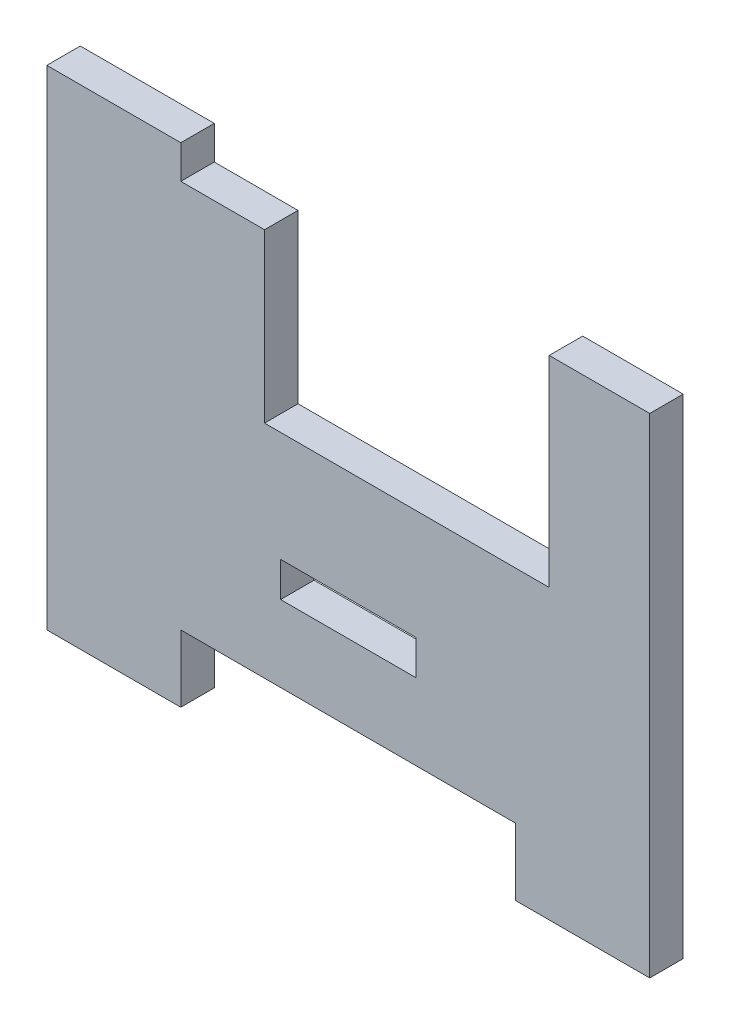
ISO-10303-21;
HEADER;
FILE_DESCRIPTION(('STEP AP214'),'2;1');
FILE_NAME('part.step','',(''),(''),'','','');
FILE_SCHEMA(('AUTOMOTIVE_DESIGN { 1 0 10303 214 1 1 1 1 }'));
ENDSEC;
DATA;
#1=APPLICATION_CONTEXT('core data for automotive mechanical design processes');
#2=APPLICATION_PROTOCOL_DEFINITION('international standard','automotive_design',2000,#1);
#3=PRODUCT_CONTEXT('',#1,'mechanical');
#4=PRODUCT('Part','Part','',(#3));
#5=PRODUCT_RELATED_PRODUCT_CATEGORY('part','',(#4));
#6=PRODUCT_DEFINITION_FORMATION('','',#4);
#7=PRODUCT_DEFINITION_CONTEXT('part definition',#1,'design');
#8=PRODUCT_DEFINITION('design','',#6,#7);
#9=PRODUCT_DEFINITION_SHAPE('','',#8);
#10=(LENGTH_UNIT() NAMED_UNIT(*) SI_UNIT(.MILLI.,.METRE.));
#11=(NAMED_UNIT(*) PLANE_ANGLE_UNIT() SI_UNIT($,.RADIAN.));
#12=(NAMED_UNIT(*) SI_UNIT($,.STERADIAN.) SOLID_ANGLE_UNIT());
#13=UNCERTAINTY_MEASURE_WITH_UNIT(LENGTH_MEASURE(1.E-05),#10,'distance_accuracy_value','');
#14=(GEOMETRIC_REPRESENTATION_CONTEXT(3) GLOBAL_UNCERTAINTY_ASSIGNED_CONTEXT((#13)) GLOBAL_UNIT_ASSIGNED_CONTEXT((#10,
#11,#12)) REPRESENTATION_CONTEXT('',''));
#15=CARTESIAN_POINT('',(0.,0.,0.));
#16=DIRECTION('',(0.,0.,1.));
#17=DIRECTION('',(1.,0.,0.));
#18=AXIS2_PLACEMENT_3D('',#15,#16,#17);
#19=CARTESIAN_POINT('',(0.,-52.5929999999991,-6.35));
#20=DIRECTION('',(0.,-1.,0.));
#21=DIRECTION('',(0.,0.,-1.));
#22=AXIS2_PLACEMENT_3D('',#19,#20,#21);
#23=PLANE('',#22);
#24=DIRECTION('',(1.,0.,0.));
#25=VECTOR('',#24,1.);
#26=CARTESIAN_POINT('',(0.,-52.5929999999991,0.));
#27=LINE('',#26,#25);
#28=CARTESIAN_POINT('',(-152.527000000001,-52.5929999999991,0.));
#29=VERTEX_POINT('',#28);
#30=CARTESIAN_POINT('',(-126.873000000001,-52.5929999999991,0.));
#31=VERTEX_POINT('',#30);
#32=EDGE_CURVE('E238',#29,#31,#27,.T.);
#33=ORIENTED_EDGE('',*,*,#32,.F.);
#34=DIRECTION('',(0.,0.,1.));
#35=VECTOR('',#34,1.);
#36=CARTESIAN_POINT('',(-152.527000000001,-52.5929999999991,-6.35));
#37=LINE('',#36,#35);
#38=CARTESIAN_POINT('',(-152.527000000001,-52.5929999999991,-6.35));
#39=VERTEX_POINT('',#38);
#40=EDGE_CURVE('E11',#39,#29,#37,.T.);
#41=ORIENTED_EDGE('',*,*,#40,.F.);
#42=DIRECTION('',(1.,0.,0.));
#43=VECTOR('',#42,1.);
#44=CARTESIAN_POINT('',(0.,-52.5929999999991,-6.35));
#45=LINE('',#44,#43);
#46=CARTESIAN_POINT('',(-126.873000000001,-52.5929999999991,-6.35));
#47=VERTEX_POINT('',#46);
#48=EDGE_CURVE('E192',#39,#47,#45,.T.);
#49=ORIENTED_EDGE('',*,*,#48,.T.);
#50=DIRECTION('',(0.,0.,1.));
#51=VECTOR('',#50,1.);
#52=CARTESIAN_POINT('',(-126.873000000001,-52.5929999999991,-6.35));
#53=LINE('',#52,#51);
#54=EDGE_CURVE('E183',#47,#31,#53,.T.);
#55=ORIENTED_EDGE('',*,*,#54,.T.);
#56=EDGE_LOOP('',(#33,#41,#49,#55));
#57=FACE_BOUND('',#56,.T.);
#58=ADVANCED_FACE('F43',(#57),#23,.T.);
#59=CARTESIAN_POINT('',(-152.527000000001,0.,-6.35));
#60=DIRECTION('',(1.,0.,0.));
#61=DIRECTION('',(0.,0.,-1.));
#62=AXIS2_PLACEMENT_3D('',#59,#60,#61);
#63=PLANE('',#62);
#64=DIRECTION('',(0.,1.,0.));
#65=VECTOR('',#64,1.);
#66=CARTESIAN_POINT('',(-152.527000000001,0.,0.));
#67=LINE('',#66,#65);
#68=CARTESIAN_POINT('',(-152.527000000001,-59.1969999999991,0.));
#69=VERTEX_POINT('',#68);
#70=EDGE_CURVE('E244',#69,#29,#67,.T.);
#71=ORIENTED_EDGE('',*,*,#70,.F.);
#72=DIRECTION('',(0.,0.,1.));
#73=VECTOR('',#72,1.);
#74=CARTESIAN_POINT('',(-152.527000000001,-59.1969999999991,-6.35));
#75=LINE('',#74,#73);
#76=CARTESIAN_POINT('',(-152.527000000001,-59.1969999999991,-6.35));
#77=VERTEX_POINT('',#76);
#78=EDGE_CURVE('E53',#77,#69,#75,.T.);
#79=ORIENTED_EDGE('',*,*,#78,.F.);
#80=DIRECTION('',(0.,1.,0.));
#81=VECTOR('',#80,1.);
#82=CARTESIAN_POINT('',(-152.527000000001,0.,-6.35));
#83=LINE('',#82,#81);
#84=EDGE_CURVE('E189',#77,#39,#83,.T.);
#85=ORIENTED_EDGE('',*,*,#84,.T.);
#86=ORIENTED_EDGE('',*,*,#40,.T.);
#87=EDGE_LOOP('',(#71,#79,#85,#86));
#88=FACE_BOUND('',#87,.T.);
#89=ADVANCED_FACE('F379',(#88),#63,.T.);
#90=CARTESIAN_POINT('',(0.,-59.1969999999991,-6.35));
#91=DIRECTION('',(0.,1.,0.));
#92=DIRECTION('',(-1.,0.,0.));
#93=AXIS2_PLACEMENT_3D('',#90,#91,#92);
#94=PLANE('',#93);
#95=DIRECTION('',(-1.,0.,0.));
#96=VECTOR('',#95,1.);
#97=CARTESIAN_POINT('',(0.,-59.1969999999991,0.));
#98=LINE('',#97,#96);
#99=CARTESIAN_POINT('',(-126.873000000001,-59.1969999999991,0.));
#100=VERTEX_POINT('',#99);
#101=EDGE_CURVE('E178',#100,#69,#98,.T.);
#102=ORIENTED_EDGE('',*,*,#101,.F.);
#103=DIRECTION('',(0.,0.,1.));
#104=VECTOR('',#103,1.);
#105=CARTESIAN_POINT('',(-126.873000000001,-59.1969999999991,-6.35));
#106=LINE('',#105,#104);
#107=CARTESIAN_POINT('',(-126.873000000001,-59.1969999999991,-6.35));
#108=VERTEX_POINT('',#107);
#109=EDGE_CURVE('E173',#108,#100,#106,.T.);
#110=ORIENTED_EDGE('',*,*,#109,.F.);
#111=DIRECTION('',(-1.,0.,0.));
#112=VECTOR('',#111,1.);
#113=CARTESIAN_POINT('',(0.,-59.1969999999991,-6.35));
#114=LINE('',#113,#112);
#115=EDGE_CURVE('E176',#108,#77,#114,.T.);
#116=ORIENTED_EDGE('',*,*,#115,.T.);
#117=ORIENTED_EDGE('',*,*,#78,.T.);
#118=EDGE_LOOP('',(#102,#110,#116,#117));
#119=FACE_BOUND('',#118,.T.);
#120=ADVANCED_FACE('F175',(#119),#94,.T.);
#121=CARTESIAN_POINT('',(0.,0.,-6.35));
#122=DIRECTION('',(0.,1.,0.));
#123=DIRECTION('',(-1.,0.,0.));
#124=AXIS2_PLACEMENT_3D('',#121,#122,#123);
#125=PLANE('',#124);
#126=DIRECTION('',(-1.,0.,0.));
#127=VECTOR('',#126,1.);
#128=CARTESIAN_POINT('',(0.,0.,0.));
#129=LINE('',#128,#127);
#130=CARTESIAN_POINT('',(-155.575,0.,0.));
#131=VERTEX_POINT('',#130);
#132=CARTESIAN_POINT('',(-171.45,0.,0.));
#133=VERTEX_POINT('',#132);
#134=EDGE_CURVE('E199',#131,#133,#129,.T.);
#135=ORIENTED_EDGE('',*,*,#134,.F.);
#136=DIRECTION('',(0.,0.,1.));
#137=VECTOR('',#136,1.);
#138=CARTESIAN_POINT('',(-155.575,0.,-6.35));
#139=LINE('',#138,#137);
#140=CARTESIAN_POINT('',(-155.575,0.,-6.35));
#141=VERTEX_POINT('',#140);
#142=EDGE_CURVE('E250',#141,#131,#139,.T.);
#143=ORIENTED_EDGE('',*,*,#142,.F.);
#144=DIRECTION('',(-1.,0.,0.));
#145=VECTOR('',#144,1.);
#146=CARTESIAN_POINT('',(0.,0.,-6.35));
#147=LINE('',#146,#145);
#148=CARTESIAN_POINT('',(-171.45,0.,-6.35));
#149=VERTEX_POINT('',#148);
#150=EDGE_CURVE('E246',#141,#149,#147,.T.);
#151=ORIENTED_EDGE('',*,*,#150,.T.);
#152=DIRECTION('',(0.,0.,1.));
#153=VECTOR('',#152,1.);
#154=CARTESIAN_POINT('',(-171.45,0.,-6.35));
#155=LINE('',#154,#153);
#156=EDGE_CURVE('E47',#149,#133,#155,.T.);
#157=ORIENTED_EDGE('',*,*,#156,.T.);
#158=EDGE_LOOP('',(#135,#143,#151,#157));
#159=FACE_BOUND('',#158,.T.);
#160=ADVANCED_FACE('F45',(#159),#125,.T.);
#161=CARTESIAN_POINT('',(-155.575,0.,-6.35));
#162=DIRECTION('',(1.,0.,0.));
#163=DIRECTION('',(0.,0.,-1.));
#164=AXIS2_PLACEMENT_3D('',#161,#162,#163);
#165=PLANE('',#164);
#166=DIRECTION('',(0.,1.,0.));
#167=VECTOR('',#166,1.);
#168=CARTESIAN_POINT('',(-155.575,0.,0.));
#169=LINE('',#168,#167);
#170=CARTESIAN_POINT('',(-155.575,-31.75,0.));
#171=VERTEX_POINT('',#170);
#172=EDGE_CURVE('E235',#171,#131,#169,.T.);
#173=ORIENTED_EDGE('',*,*,#172,.F.);
#174=DIRECTION('',(0.,0.,1.));
#175=VECTOR('',#174,1.);
#176=CARTESIAN_POINT('',(-155.575,-31.75,-6.35));
#177=LINE('',#176,#175);
#178=CARTESIAN_POINT('',(-155.575,-31.75,-6.35));
#179=VERTEX_POINT('',#178);
#180=EDGE_CURVE('E252',#179,#171,#177,.T.);
#181=ORIENTED_EDGE('',*,*,#180,.F.);
#182=DIRECTION('',(0.,1.,0.));
#183=VECTOR('',#182,1.);
#184=CARTESIAN_POINT('',(-155.575,0.,-6.35));
#185=LINE('',#184,#183);
#186=EDGE_CURVE('E194',#179,#141,#185,.T.);
#187=ORIENTED_EDGE('',*,*,#186,.T.);
#188=ORIENTED_EDGE('',*,*,#142,.T.);
#189=EDGE_LOOP('',(#173,#181,#187,#188));
#190=FACE_BOUND('',#189,.T.);
#191=ADVANCED_FACE('F291',(#190),#165,.T.);
#192=CARTESIAN_POINT('',(0.,-31.75,-6.35));
#193=DIRECTION('',(0.,1.,0.));
#194=DIRECTION('',(-1.,0.,0.));
#195=AXIS2_PLACEMENT_3D('',#192,#193,#194);
#196=PLANE('',#195);
#197=DIRECTION('',(-1.,0.,0.));
#198=VECTOR('',#197,1.);
#199=CARTESIAN_POINT('',(0.,-31.75,0.));
#200=LINE('',#199,#198);
#201=CARTESIAN_POINT('',(-101.6,-31.75,0.));
#202=VERTEX_POINT('',#201);
#203=EDGE_CURVE('E232',#202,#171,#200,.T.);
#204=ORIENTED_EDGE('',*,*,#203,.F.);
#205=DIRECTION('',(0.,0.,1.));
#206=VECTOR('',#205,1.);
#207=CARTESIAN_POINT('',(-101.6,-31.75,-6.35));
#208=LINE('',#207,#206);
#209=CARTESIAN_POINT('',(-101.6,-31.75,-6.35));
#210=VERTEX_POINT('',#209);
#211=EDGE_CURVE('E254',#210,#202,#208,.T.);
#212=ORIENTED_EDGE('',*,*,#211,.F.);
#213=DIRECTION('',(-1.,0.,0.));
#214=VECTOR('',#213,1.);
#215=CARTESIAN_POINT('',(0.,-31.75,-6.35));
#216=LINE('',#215,#214);
#217=EDGE_CURVE('E324',#210,#179,#216,.T.);
#218=ORIENTED_EDGE('',*,*,#217,.T.);
#219=ORIENTED_EDGE('',*,*,#180,.T.);
#220=EDGE_LOOP('',(#204,#212,#218,#219));
#221=FACE_BOUND('',#220,.T.);
#222=ADVANCED_FACE('F326',(#221),#196,.T.);
#223=CARTESIAN_POINT('',(-101.6,0.,-6.35));
#224=DIRECTION('',(1.,0.,0.));
#225=DIRECTION('',(0.,0.,-1.));
#226=AXIS2_PLACEMENT_3D('',#223,#224,#225);
#227=PLANE('',#226);
#228=DIRECTION('',(0.,1.,0.));
#229=VECTOR('',#228,1.);
#230=CARTESIAN_POINT('',(-101.6,0.,0.));
#231=LINE('',#230,#229);
#232=CARTESIAN_POINT('',(-101.6,6.35000000000001,0.));
#233=VERTEX_POINT('',#232);
#234=EDGE_CURVE('E229',#202,#233,#231,.T.);
#235=ORIENTED_EDGE('',*,*,#234,.T.);
#236=DIRECTION('',(0.,0.,1.));
#237=VECTOR('',#236,1.);
#238=CARTESIAN_POINT('',(-101.6,6.35000000000001,-6.35));
#239=LINE('',#238,#237);
#240=CARTESIAN_POINT('',(-101.6,6.35000000000001,-6.35));
#241=VERTEX_POINT('',#240);
#242=EDGE_CURVE('E256',#241,#233,#239,.T.);
#243=ORIENTED_EDGE('',*,*,#242,.F.);
#244=DIRECTION('',(0.,1.,0.));
#245=VECTOR('',#244,1.);
#246=CARTESIAN_POINT('',(-101.6,0.,-6.35));
#247=LINE('',#246,#245);
#248=EDGE_CURVE('E322',#210,#241,#247,.T.);
#249=ORIENTED_EDGE('',*,*,#248,.F.);
#250=ORIENTED_EDGE('',*,*,#211,.T.);
#251=EDGE_LOOP('',(#235,#243,#249,#250));
#252=FACE_BOUND('',#251,.T.);
#253=ADVANCED_FACE('F331',(#252),#227,.F.);
#254=CARTESIAN_POINT('',(0.,6.35000000000001,-6.35));
#255=DIRECTION('',(0.,1.,0.));
#256=DIRECTION('',(0.,0.,1.));
#257=AXIS2_PLACEMENT_3D('',#254,#255,#256);
#258=PLANE('',#257);
#259=DIRECTION('',(-1.,0.,0.));
#260=VECTOR('',#259,1.);
#261=CARTESIAN_POINT('',(0.,6.35000000000001,0.));
#262=LINE('',#261,#260);
#263=CARTESIAN_POINT('',(-82.55,6.35000000000001,0.));
#264=VERTEX_POINT('',#263);
#265=EDGE_CURVE('E226',#264,#233,#262,.T.);
#266=ORIENTED_EDGE('',*,*,#265,.F.);
#267=DIRECTION('',(0.,0.,1.));
#268=VECTOR('',#267,1.);
#269=CARTESIAN_POINT('',(-82.55,6.35000000000001,-6.35));
#270=LINE('',#269,#268);
#271=CARTESIAN_POINT('',(-82.55,6.35000000000001,-6.35));
#272=VERTEX_POINT('',#271);
#273=EDGE_CURVE('E258',#272,#264,#270,.T.);
#274=ORIENTED_EDGE('',*,*,#273,.F.);
#275=DIRECTION('',(-1.,0.,0.));
#276=VECTOR('',#275,1.);
#277=CARTESIAN_POINT('',(0.,6.35000000000001,-6.35));
#278=LINE('',#277,#276);
#279=EDGE_CURVE('E319',#272,#241,#278,.T.);
#280=ORIENTED_EDGE('',*,*,#279,.T.);
#281=ORIENTED_EDGE('',*,*,#242,.T.);
#282=EDGE_LOOP('',(#266,#274,#280,#281));
#283=FACE_BOUND('',#282,.T.);
#284=ADVANCED_FACE('F334',(#283),#258,.T.);
#285=CARTESIAN_POINT('',(-82.5499999999997,3.60822483003174E-13,-6.35));
#286=DIRECTION('',(-1.,0.,0.));
#287=DIRECTION('',(0.,-1.,0.));
#288=AXIS2_PLACEMENT_3D('',#285,#286,#287);
#289=PLANE('',#288);
#290=DIRECTION('',(0.,-1.,0.));
#291=VECTOR('',#290,1.);
#292=CARTESIAN_POINT('',(-82.5499999999997,3.60822483003174E-13,0.));
#293=LINE('',#292,#291);
#294=CARTESIAN_POINT('',(-82.55,-86.34,0.));
#295=VERTEX_POINT('',#294);
#296=EDGE_CURVE('E224',#264,#295,#293,.T.);
#297=ORIENTED_EDGE('',*,*,#296,.T.);
#298=DIRECTION('',(0.,0.,1.));
#299=VECTOR('',#298,1.);
#300=CARTESIAN_POINT('',(-82.55,-86.34,-6.35));
#301=LINE('',#300,#299);
#302=CARTESIAN_POINT('',(-82.55,-86.34,-6.35));
#303=VERTEX_POINT('',#302);
#304=EDGE_CURVE('E260',#303,#295,#301,.T.);
#305=ORIENTED_EDGE('',*,*,#304,.F.);
#306=DIRECTION('',(0.,-1.,0.));
#307=VECTOR('',#306,1.);
#308=CARTESIAN_POINT('',(-82.5499999999997,3.60822483003174E-13,-6.35));
#309=LINE('',#308,#307);
#310=EDGE_CURVE('E317',#272,#303,#309,.T.);
#311=ORIENTED_EDGE('',*,*,#310,.F.);
#312=ORIENTED_EDGE('',*,*,#273,.T.);
#313=EDGE_LOOP('',(#297,#305,#311,#312));
#314=FACE_BOUND('',#313,.T.);
#315=ADVANCED_FACE('F339',(#314),#289,.F.);
#316=CARTESIAN_POINT('',(0.,-86.34,-6.35));
#317=DIRECTION('',(0.,1.,0.));
#318=DIRECTION('',(0.,0.,1.));
#319=AXIS2_PLACEMENT_3D('',#316,#317,#318);
#320=PLANE('',#319);
#321=DIRECTION('',(-1.,0.,0.));
#322=VECTOR('',#321,1.);
#323=CARTESIAN_POINT('',(0.,-86.34,0.));
#324=LINE('',#323,#322);
#325=CARTESIAN_POINT('',(-107.95,-86.34,0.));
#326=VERTEX_POINT('',#325);
#327=EDGE_CURVE('E221',#295,#326,#324,.T.);
#328=ORIENTED_EDGE('',*,*,#327,.T.);
#329=DIRECTION('',(0.,0.,1.));
#330=VECTOR('',#329,1.);
#331=CARTESIAN_POINT('',(-107.95,-86.34,-6.35));
#332=LINE('',#331,#330);
#333=CARTESIAN_POINT('',(-107.95,-86.34,-6.35));
#334=VERTEX_POINT('',#333);
#335=EDGE_CURVE('E263',#334,#326,#332,.T.);
#336=ORIENTED_EDGE('',*,*,#335,.F.);
#337=DIRECTION('',(-1.,0.,0.));
#338=VECTOR('',#337,1.);
#339=CARTESIAN_POINT('',(0.,-86.34,-6.35));
#340=LINE('',#339,#338);
#341=EDGE_CURVE('E315',#303,#334,#340,.T.);
#342=ORIENTED_EDGE('',*,*,#341,.F.);
#343=ORIENTED_EDGE('',*,*,#304,.T.);
#344=EDGE_LOOP('',(#328,#336,#342,#343));
#345=FACE_BOUND('',#344,.T.);
#346=ADVANCED_FACE('F344',(#345),#320,.F.);
#347=CARTESIAN_POINT('',(-107.95,2.35922392732846E-13,-6.35));
#348=DIRECTION('',(-1.,0.,0.));
#349=DIRECTION('',(0.,-1.,0.));
#350=AXIS2_PLACEMENT_3D('',#347,#348,#349);
#351=PLANE('',#350);
#352=DIRECTION('',(0.,-1.,0.));
#353=VECTOR('',#352,1.);
#354=CARTESIAN_POINT('',(-107.95,2.35922392732846E-13,0.));
#355=LINE('',#354,#353);
#356=CARTESIAN_POINT('',(-107.95,-73.64,0.));
#357=VERTEX_POINT('',#356);
#358=EDGE_CURVE('E218',#357,#326,#355,.T.);
#359=ORIENTED_EDGE('',*,*,#358,.F.);
#360=DIRECTION('',(0.,0.,1.));
#361=VECTOR('',#360,1.);
#362=CARTESIAN_POINT('',(-107.95,-73.64,-6.35));
#363=LINE('',#362,#361);
#364=CARTESIAN_POINT('',(-107.95,-73.64,-6.35));
#365=VERTEX_POINT('',#364);
#366=EDGE_CURVE('E265',#365,#357,#363,.T.);
#367=ORIENTED_EDGE('',*,*,#366,.F.);
#368=DIRECTION('',(0.,-1.,0.));
#369=VECTOR('',#368,1.);
#370=CARTESIAN_POINT('',(-107.95,2.35922392732846E-13,-6.35));
#371=LINE('',#370,#369);
#372=EDGE_CURVE('E312',#365,#334,#371,.T.);
#373=ORIENTED_EDGE('',*,*,#372,.T.);
#374=ORIENTED_EDGE('',*,*,#335,.T.);
#375=EDGE_LOOP('',(#359,#367,#373,#374));
#376=FACE_BOUND('',#375,.T.);
#377=ADVANCED_FACE('F348',(#376),#351,.T.);
#378=CARTESIAN_POINT('',(-3.54064983806042E-13,-73.6400000000005,-6.35));
#379=DIRECTION('',(0.,1.,0.));
#380=DIRECTION('',(-1.,0.,0.));
#381=AXIS2_PLACEMENT_3D('',#378,#379,#380);
#382=PLANE('',#381);
#383=DIRECTION('',(-1.,0.,0.));
#384=VECTOR('',#383,1.);
#385=CARTESIAN_POINT('',(-3.54064983806042E-13,-73.6400000000005,0.));
#386=LINE('',#385,#384);
#387=CARTESIAN_POINT('',(-171.450000000001,-73.6399999999997,0.));
#388=VERTEX_POINT('',#387);
#389=EDGE_CURVE('E216',#357,#388,#386,.T.);
#390=ORIENTED_EDGE('',*,*,#389,.T.);
#391=DIRECTION('',(0.,0.,1.));
#392=VECTOR('',#391,1.);
#393=CARTESIAN_POINT('',(-171.450000000001,-73.6399999999997,-6.35));
#394=LINE('',#393,#392);
#395=CARTESIAN_POINT('',(-171.450000000001,-73.6399999999997,-6.35));
#396=VERTEX_POINT('',#395);
#397=EDGE_CURVE('E267',#396,#388,#394,.T.);
#398=ORIENTED_EDGE('',*,*,#397,.F.);
#399=DIRECTION('',(-1.,0.,0.));
#400=VECTOR('',#399,1.);
#401=CARTESIAN_POINT('',(-3.54064983806042E-13,-73.6400000000005,-6.35));
#402=LINE('',#401,#400);
#403=EDGE_CURVE('E310',#365,#396,#402,.T.);
#404=ORIENTED_EDGE('',*,*,#403,.F.);
#405=ORIENTED_EDGE('',*,*,#366,.T.);
#406=EDGE_LOOP('',(#390,#398,#404,#405));
#407=FACE_BOUND('',#406,.T.);
#408=ADVANCED_FACE('F353',(#407),#382,.F.);
#409=CARTESIAN_POINT('',(-171.45000000001,-1.98591143529832E-11,-6.35));
#410=DIRECTION('',(-1.,-1.15830354931362E-13,0.));
#411=DIRECTION('',(1.15830354931362E-13,-1.,0.));
#412=AXIS2_PLACEMENT_3D('',#409,#410,#411);
#413=PLANE('',#412);
#414=DIRECTION('',(1.15830354931362E-13,-1.,0.));
#415=VECTOR('',#414,1.);
#416=CARTESIAN_POINT('',(-171.45000000001,-1.98591143529832E-11,0.));
#417=LINE('',#416,#415);
#418=CARTESIAN_POINT('',(-171.45,-86.34,0.));
#419=VERTEX_POINT('',#418);
#420=EDGE_CURVE('E213',#388,#419,#417,.T.);
#421=ORIENTED_EDGE('',*,*,#420,.T.);
#422=DIRECTION('',(0.,0.,1.));
#423=VECTOR('',#422,1.);
#424=CARTESIAN_POINT('',(-171.45,-86.34,-6.35));
#425=LINE('',#424,#423);
#426=CARTESIAN_POINT('',(-171.45,-86.34,-6.35));
#427=VERTEX_POINT('',#426);
#428=EDGE_CURVE('E270',#427,#419,#425,.T.);
#429=ORIENTED_EDGE('',*,*,#428,.F.);
#430=DIRECTION('',(1.15830354931362E-13,-1.,0.));
#431=VECTOR('',#430,1.);
#432=CARTESIAN_POINT('',(-171.45000000001,-1.98591143529832E-11,-6.35));
#433=LINE('',#432,#431);
#434=EDGE_CURVE('E308',#396,#427,#433,.T.);
#435=ORIENTED_EDGE('',*,*,#434,.F.);
#436=ORIENTED_EDGE('',*,*,#397,.T.);
#437=EDGE_LOOP('',(#421,#429,#435,#436));
#438=FACE_BOUND('',#437,.T.);
#439=ADVANCED_FACE('F358',(#438),#413,.F.);
#440=CARTESIAN_POINT('',(0.,-86.34,-6.35));
#441=DIRECTION('',(0.,-1.,0.));
#442=DIRECTION('',(0.,0.,-1.));
#443=AXIS2_PLACEMENT_3D('',#440,#441,#442);
#444=PLANE('',#443);
#445=DIRECTION('',(1.,0.,0.));
#446=VECTOR('',#445,1.);
#447=CARTESIAN_POINT('',(0.,-86.34,0.));
#448=LINE('',#447,#446);
#449=CARTESIAN_POINT('',(-196.85,-86.34,0.));
#450=VERTEX_POINT('',#449);
#451=EDGE_CURVE('E210',#450,#419,#448,.T.);
#452=ORIENTED_EDGE('',*,*,#451,.F.);
#453=DIRECTION('',(0.,0.,1.));
#454=VECTOR('',#453,1.);
#455=CARTESIAN_POINT('',(-196.85,-86.34,-6.35));
#456=LINE('',#455,#454);
#457=CARTESIAN_POINT('',(-196.85,-86.34,-6.35));
#458=VERTEX_POINT('',#457);
#459=EDGE_CURVE('E272',#458,#450,#456,.T.);
#460=ORIENTED_EDGE('',*,*,#459,.F.);
#461=DIRECTION('',(1.,0.,0.));
#462=VECTOR('',#461,1.);
#463=CARTESIAN_POINT('',(0.,-86.34,-6.35));
#464=LINE('',#463,#462);
#465=EDGE_CURVE('E305',#458,#427,#464,.T.);
#466=ORIENTED_EDGE('',*,*,#465,.T.);
#467=ORIENTED_EDGE('',*,*,#428,.T.);
#468=EDGE_LOOP('',(#452,#460,#466,#467));
#469=FACE_BOUND('',#468,.T.);
#470=ADVANCED_FACE('F362',(#469),#444,.T.);
#471=CARTESIAN_POINT('',(-196.85,0.,-6.35));
#472=DIRECTION('',(1.,0.,0.));
#473=DIRECTION('',(0.,0.,-1.));
#474=AXIS2_PLACEMENT_3D('',#471,#472,#473);
#475=PLANE('',#474);
#476=DIRECTION('',(0.,1.,0.));
#477=VECTOR('',#476,1.);
#478=CARTESIAN_POINT('',(-196.85,0.,0.));
#479=LINE('',#478,#477);
#480=CARTESIAN_POINT('',(-196.85,6.35000000000001,0.));
#481=VERTEX_POINT('',#480);
#482=EDGE_CURVE('E208',#450,#481,#479,.T.);
#483=ORIENTED_EDGE('',*,*,#482,.T.);
#484=DIRECTION('',(0.,0.,1.));
#485=VECTOR('',#484,1.);
#486=CARTESIAN_POINT('',(-196.85,6.35000000000001,-6.35));
#487=LINE('',#486,#485);
#488=CARTESIAN_POINT('',(-196.85,6.35000000000001,-6.35));
#489=VERTEX_POINT('',#488);
#490=EDGE_CURVE('E274',#489,#481,#487,.T.);
#491=ORIENTED_EDGE('',*,*,#490,.F.);
#492=DIRECTION('',(0.,1.,0.));
#493=VECTOR('',#492,1.);
#494=CARTESIAN_POINT('',(-196.85,0.,-6.35));
#495=LINE('',#494,#493);
#496=EDGE_CURVE('E303',#458,#489,#495,.T.);
#497=ORIENTED_EDGE('',*,*,#496,.F.);
#498=ORIENTED_EDGE('',*,*,#459,.T.);
#499=EDGE_LOOP('',(#483,#491,#497,#498));
#500=FACE_BOUND('',#499,.T.);
#501=ADVANCED_FACE('F367',(#500),#475,.F.);
#502=CARTESIAN_POINT('',(0.,6.35000000000023,-6.35));
#503=DIRECTION('',(0.,-1.,0.));
#504=DIRECTION('',(1.,0.,0.));
#505=AXIS2_PLACEMENT_3D('',#502,#503,#504);
#506=PLANE('',#505);
#507=DIRECTION('',(1.,0.,0.));
#508=VECTOR('',#507,1.);
#509=CARTESIAN_POINT('',(0.,6.35000000000023,0.));
#510=LINE('',#509,#508);
#511=CARTESIAN_POINT('',(-171.45,6.35000000000004,0.));
#512=VERTEX_POINT('',#511);
#513=EDGE_CURVE('E205',#481,#512,#510,.T.);
#514=ORIENTED_EDGE('',*,*,#513,.T.);
#515=DIRECTION('',(0.,0.,1.));
#516=VECTOR('',#515,1.);
#517=CARTESIAN_POINT('',(-171.45,6.35000000000004,-6.35));
#518=LINE('',#517,#516);
#519=CARTESIAN_POINT('',(-171.45,6.35000000000004,-6.35));
#520=VERTEX_POINT('',#519);
#521=EDGE_CURVE('E276',#520,#512,#518,.T.);
#522=ORIENTED_EDGE('',*,*,#521,.F.);
#523=DIRECTION('',(1.,0.,0.));
#524=VECTOR('',#523,1.);
#525=CARTESIAN_POINT('',(0.,6.35000000000023,-6.35));
#526=LINE('',#525,#524);
#527=EDGE_CURVE('E299',#489,#520,#526,.T.);
#528=ORIENTED_EDGE('',*,*,#527,.F.);
#529=ORIENTED_EDGE('',*,*,#490,.T.);
#530=EDGE_LOOP('',(#514,#522,#528,#529));
#531=FACE_BOUND('',#530,.T.);
#532=ADVANCED_FACE('F370',(#531),#506,.F.);
#533=CARTESIAN_POINT('',(-171.45,0.,-6.35));
#534=DIRECTION('',(1.,0.,0.));
#535=DIRECTION('',(0.,0.,-1.));
#536=AXIS2_PLACEMENT_3D('',#533,#534,#535);
#537=PLANE('',#536);
#538=DIRECTION('',(0.,1.,0.));
#539=VECTOR('',#538,1.);
#540=CARTESIAN_POINT('',(-171.45,0.,0.));
#541=LINE('',#540,#539);
#542=EDGE_CURVE('E202',#133,#512,#541,.T.);
#543=ORIENTED_EDGE('',*,*,#542,.F.);
#544=ORIENTED_EDGE('',*,*,#156,.F.);
#545=DIRECTION('',(0.,1.,0.));
#546=VECTOR('',#545,1.);
#547=CARTESIAN_POINT('',(-171.45,0.,-6.35));
#548=LINE('',#547,#546);
#549=EDGE_CURVE('E297',#149,#520,#548,.T.);
#550=ORIENTED_EDGE('',*,*,#549,.T.);
#551=ORIENTED_EDGE('',*,*,#521,.T.);
#552=EDGE_LOOP('',(#543,#544,#550,#551));
#553=FACE_BOUND('',#552,.T.);
#554=ADVANCED_FACE('F282',(#553),#537,.T.);
#555=CARTESIAN_POINT('',(-126.873000000001,0.,-6.35));
#556=DIRECTION('',(-1.,0.,0.));
#557=DIRECTION('',(0.,0.,1.));
#558=AXIS2_PLACEMENT_3D('',#555,#556,#557);
#559=PLANE('',#558);
#560=DIRECTION('',(0.,-1.,0.));
#561=VECTOR('',#560,1.);
#562=CARTESIAN_POINT('',(-126.873000000001,0.,0.));
#563=LINE('',#562,#561);
#564=EDGE_CURVE('E241',#31,#100,#563,.T.);
#565=ORIENTED_EDGE('',*,*,#564,.F.);
#566=ORIENTED_EDGE('',*,*,#54,.F.);
#567=DIRECTION('',(0.,-1.,0.));
#568=VECTOR('',#567,1.);
#569=CARTESIAN_POINT('',(-126.873000000001,0.,-6.35));
#570=LINE('',#569,#568);
#571=EDGE_CURVE('E188',#47,#108,#570,.T.);
#572=ORIENTED_EDGE('',*,*,#571,.T.);
#573=ORIENTED_EDGE('',*,*,#109,.T.);
#574=EDGE_LOOP('',(#565,#566,#572,#573));
#575=FACE_BOUND('',#574,.T.);
#576=ADVANCED_FACE('F191',(#575),#559,.T.);
#577=CARTESIAN_POINT('',(0.,0.,-6.35));
#578=DIRECTION('',(0.,0.,1.));
#579=DIRECTION('',(1.,0.,0.));
#580=AXIS2_PLACEMENT_3D('',#577,#578,#579);
#581=PLANE('',#580);
#582=ORIENTED_EDGE('',*,*,#150,.F.);
#583=ORIENTED_EDGE('',*,*,#186,.F.);
#584=ORIENTED_EDGE('',*,*,#217,.F.);
#585=ORIENTED_EDGE('',*,*,#248,.T.);
#586=ORIENTED_EDGE('',*,*,#279,.F.);
#587=ORIENTED_EDGE('',*,*,#310,.T.);
#588=ORIENTED_EDGE('',*,*,#341,.T.);
#589=ORIENTED_EDGE('',*,*,#372,.F.);
#590=ORIENTED_EDGE('',*,*,#403,.T.);
#591=ORIENTED_EDGE('',*,*,#434,.T.);
#592=ORIENTED_EDGE('',*,*,#465,.F.);
#593=ORIENTED_EDGE('',*,*,#496,.T.);
#594=ORIENTED_EDGE('',*,*,#527,.T.);
#595=ORIENTED_EDGE('',*,*,#549,.F.);
#596=EDGE_LOOP('',(#582,#583,#584,#585,#586,#587,#588,#589,#590,#591,#592,#593,#594,#595));
#597=FACE_BOUND('',#596,.T.);
#598=ORIENTED_EDGE('',*,*,#48,.F.);
#599=ORIENTED_EDGE('',*,*,#84,.F.);
#600=ORIENTED_EDGE('',*,*,#115,.F.);
#601=ORIENTED_EDGE('',*,*,#571,.F.);
#602=EDGE_LOOP('',(#598,#599,#600,#601));
#603=FACE_BOUND('',#602,.T.);
#604=ADVANCED_FACE('F187',(#597,#603),#581,.F.);
#605=CARTESIAN_POINT('',(0.,0.,0.));
#606=DIRECTION('',(0.,0.,1.));
#607=DIRECTION('',(1.,0.,0.));
#608=AXIS2_PLACEMENT_3D('',#605,#606,#607);
#609=PLANE('',#608);
#610=ORIENTED_EDGE('',*,*,#134,.T.);
#611=ORIENTED_EDGE('',*,*,#542,.T.);
#612=ORIENTED_EDGE('',*,*,#513,.F.);
#613=ORIENTED_EDGE('',*,*,#482,.F.);
#614=ORIENTED_EDGE('',*,*,#451,.T.);
#615=ORIENTED_EDGE('',*,*,#420,.F.);
#616=ORIENTED_EDGE('',*,*,#389,.F.);
#617=ORIENTED_EDGE('',*,*,#358,.T.);
#618=ORIENTED_EDGE('',*,*,#327,.F.);
#619=ORIENTED_EDGE('',*,*,#296,.F.);
#620=ORIENTED_EDGE('',*,*,#265,.T.);
#621=ORIENTED_EDGE('',*,*,#234,.F.);
#622=ORIENTED_EDGE('',*,*,#203,.T.);
#623=ORIENTED_EDGE('',*,*,#172,.T.);
#624=EDGE_LOOP('',(#610,#611,#612,#613,#614,#615,#616,#617,#618,#619,#620,#621,#622,#623));
#625=FACE_BOUND('',#624,.T.);
#626=ORIENTED_EDGE('',*,*,#32,.T.);
#627=ORIENTED_EDGE('',*,*,#564,.T.);
#628=ORIENTED_EDGE('',*,*,#101,.T.);
#629=ORIENTED_EDGE('',*,*,#70,.T.);
#630=EDGE_LOOP('',(#626,#627,#628,#629));
#631=FACE_BOUND('',#630,.T.);
#632=ADVANCED_FACE('F285',(#625,#631),#609,.T.);
#633=CLOSED_SHELL('',(#58,#89,#120,#160,#191,#222,#253,#284,#315,#346,#377,#408,#439,#470,#501,
#532,#554,#576,#604,#632));
#634=MANIFOLD_SOLID_BREP('B2',#633);
#635=ADVANCED_BREP_SHAPE_REPRESENTATION('',(#18,#634),#14);
#636=SHAPE_DEFINITION_REPRESENTATION(#9,#635);
ENDSEC;
END-ISO-10303-21;
